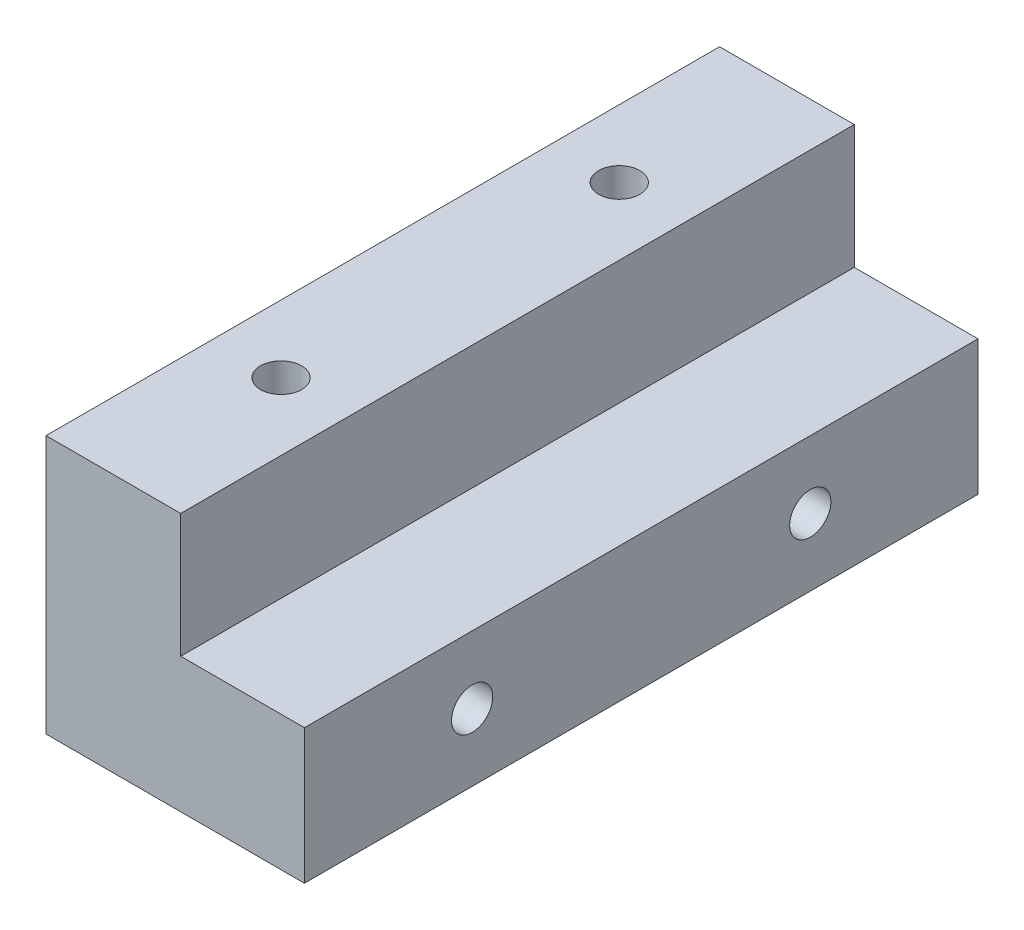
ISO-10303-21;
HEADER;
FILE_DESCRIPTION(('STEP AP214'),'2;1');
FILE_NAME('part.step','',(''),(''),'','','');
FILE_SCHEMA(('AUTOMOTIVE_DESIGN { 1 0 10303 214 1 1 1 1 }'));
ENDSEC;
DATA;
#1=APPLICATION_CONTEXT('core data for automotive mechanical design processes');
#2=APPLICATION_PROTOCOL_DEFINITION('international standard','automotive_design',2000,#1);
#3=PRODUCT_CONTEXT('',#1,'mechanical');
#4=PRODUCT('Part','Part','',(#3));
#5=PRODUCT_RELATED_PRODUCT_CATEGORY('part','',(#4));
#6=PRODUCT_DEFINITION_FORMATION('','',#4);
#7=PRODUCT_DEFINITION_CONTEXT('part definition',#1,'design');
#8=PRODUCT_DEFINITION('design','',#6,#7);
#9=PRODUCT_DEFINITION_SHAPE('','',#8);
#10=(LENGTH_UNIT() NAMED_UNIT(*) SI_UNIT(.MILLI.,.METRE.));
#11=(NAMED_UNIT(*) PLANE_ANGLE_UNIT() SI_UNIT($,.RADIAN.));
#12=(NAMED_UNIT(*) SI_UNIT($,.STERADIAN.) SOLID_ANGLE_UNIT());
#13=UNCERTAINTY_MEASURE_WITH_UNIT(LENGTH_MEASURE(1.E-05),#10,'distance_accuracy_value','');
#14=(GEOMETRIC_REPRESENTATION_CONTEXT(3) GLOBAL_UNCERTAINTY_ASSIGNED_CONTEXT((#13)) GLOBAL_UNIT_ASSIGNED_CONTEXT((#10,
#11,#12)) REPRESENTATION_CONTEXT('',''));
#15=CARTESIAN_POINT('',(0.,0.,0.));
#16=DIRECTION('',(0.,0.,1.));
#17=DIRECTION('',(1.,0.,0.));
#18=AXIS2_PLACEMENT_3D('',#15,#16,#17);
#19=CARTESIAN_POINT('',(4.9,9.4,24.5));
#20=DIRECTION('',(0.,-1.,0.));
#21=DIRECTION('',(1.,0.,0.));
#22=AXIS2_PLACEMENT_3D('',#19,#20,#21);
#23=PLANE('',#22);
#24=CARTESIAN_POINT('',(2.45,9.4,18.4));
#25=DIRECTION('',(0.,1.,0.));
#26=DIRECTION('',(-1.,0.,0.));
#27=AXIS2_PLACEMENT_3D('',#24,#25,#26);
#28=CIRCLE('',#27,0.75);
#29=CARTESIAN_POINT('',(1.7,9.4,18.4));
#30=VERTEX_POINT('',#29);
#31=EDGE_CURVE('E159',#30,#30,#28,.T.);
#32=ORIENTED_EDGE('',*,*,#31,.F.);
#33=EDGE_LOOP('',(#32));
#34=FACE_BOUND('',#33,.T.);
#35=CARTESIAN_POINT('',(2.45,9.4,6.1));
#36=DIRECTION('',(0.,1.,0.));
#37=DIRECTION('',(-1.,0.,0.));
#38=AXIS2_PLACEMENT_3D('',#35,#36,#37);
#39=CIRCLE('',#38,0.75);
#40=CARTESIAN_POINT('',(1.7,9.4,6.1));
#41=VERTEX_POINT('',#40);
#42=EDGE_CURVE('E162',#41,#41,#39,.T.);
#43=ORIENTED_EDGE('',*,*,#42,.F.);
#44=EDGE_LOOP('',(#43));
#45=FACE_BOUND('',#44,.T.);
#46=DIRECTION('',(-1.,0.,0.));
#47=VECTOR('',#46,1.);
#48=CARTESIAN_POINT('',(4.9,9.4,0.));
#49=LINE('',#48,#47);
#50=CARTESIAN_POINT('',(4.9,9.4,0.));
#51=VERTEX_POINT('',#50);
#52=CARTESIAN_POINT('',(0.,9.4,0.));
#53=VERTEX_POINT('',#52);
#54=EDGE_CURVE('E116',#51,#53,#49,.T.);
#55=ORIENTED_EDGE('',*,*,#54,.T.);
#56=DIRECTION('',(0.,0.,-1.));
#57=VECTOR('',#56,1.);
#58=CARTESIAN_POINT('',(0.,9.4,24.5));
#59=LINE('',#58,#57);
#60=CARTESIAN_POINT('',(0.,9.4,24.5));
#61=VERTEX_POINT('',#60);
#62=EDGE_CURVE('E11',#61,#53,#59,.T.);
#63=ORIENTED_EDGE('',*,*,#62,.F.);
#64=DIRECTION('',(-1.,0.,0.));
#65=VECTOR('',#64,1.);
#66=CARTESIAN_POINT('',(4.9,9.4,24.5));
#67=LINE('',#66,#65);
#68=CARTESIAN_POINT('',(4.9,9.4,24.5));
#69=VERTEX_POINT('',#68);
#70=EDGE_CURVE('E127',#69,#61,#67,.T.);
#71=ORIENTED_EDGE('',*,*,#70,.F.);
#72=DIRECTION('',(0.,0.,-1.));
#73=VECTOR('',#72,1.);
#74=CARTESIAN_POINT('',(4.9,9.4,24.5));
#75=LINE('',#74,#73);
#76=EDGE_CURVE('E112',#69,#51,#75,.T.);
#77=ORIENTED_EDGE('',*,*,#76,.T.);
#78=EDGE_LOOP('',(#55,#63,#71,#77));
#79=FACE_BOUND('',#78,.T.);
#80=ADVANCED_FACE('F32',(#34,#45,#79),#23,.F.);
#81=CARTESIAN_POINT('',(0.,9.4,24.5));
#82=DIRECTION('',(1.,0.,0.));
#83=DIRECTION('',(0.,1.,0.));
#84=AXIS2_PLACEMENT_3D('',#81,#82,#83);
#85=PLANE('',#84);
#86=DIRECTION('',(0.,-1.,0.));
#87=VECTOR('',#86,1.);
#88=CARTESIAN_POINT('',(0.,9.4,0.));
#89=LINE('',#88,#87);
#90=CARTESIAN_POINT('',(0.,0.,0.));
#91=VERTEX_POINT('',#90);
#92=EDGE_CURVE('E119',#53,#91,#89,.T.);
#93=ORIENTED_EDGE('',*,*,#92,.T.);
#94=DIRECTION('',(0.,0.,-1.));
#95=VECTOR('',#94,1.);
#96=CARTESIAN_POINT('',(0.,0.,24.5));
#97=LINE('',#96,#95);
#98=CARTESIAN_POINT('',(0.,0.,24.5));
#99=VERTEX_POINT('',#98);
#100=EDGE_CURVE('E40',#99,#91,#97,.T.);
#101=ORIENTED_EDGE('',*,*,#100,.F.);
#102=DIRECTION('',(0.,-1.,0.));
#103=VECTOR('',#102,1.);
#104=CARTESIAN_POINT('',(0.,9.4,24.5));
#105=LINE('',#104,#103);
#106=EDGE_CURVE('E85',#61,#99,#105,.T.);
#107=ORIENTED_EDGE('',*,*,#106,.F.);
#108=ORIENTED_EDGE('',*,*,#62,.T.);
#109=EDGE_LOOP('',(#93,#101,#107,#108));
#110=FACE_BOUND('',#109,.T.);
#111=ADVANCED_FACE('F151',(#110),#85,.F.);
#112=CARTESIAN_POINT('',(0.,0.,24.5));
#113=DIRECTION('',(0.,1.,0.));
#114=DIRECTION('',(-1.,0.,0.));
#115=AXIS2_PLACEMENT_3D('',#112,#113,#114);
#116=PLANE('',#115);
#117=DIRECTION('',(1.,0.,0.));
#118=VECTOR('',#117,1.);
#119=CARTESIAN_POINT('',(0.,0.,0.));
#120=LINE('',#119,#118);
#121=CARTESIAN_POINT('',(9.4,0.,0.));
#122=VERTEX_POINT('',#121);
#123=EDGE_CURVE('E122',#91,#122,#120,.T.);
#124=ORIENTED_EDGE('',*,*,#123,.T.);
#125=DIRECTION('',(0.,0.,-1.));
#126=VECTOR('',#125,1.);
#127=CARTESIAN_POINT('',(9.4,0.,24.5));
#128=LINE('',#127,#126);
#129=CARTESIAN_POINT('',(9.4,0.,24.5));
#130=VERTEX_POINT('',#129);
#131=EDGE_CURVE('E107',#130,#122,#128,.T.);
#132=ORIENTED_EDGE('',*,*,#131,.F.);
#133=DIRECTION('',(1.,0.,0.));
#134=VECTOR('',#133,1.);
#135=CARTESIAN_POINT('',(0.,0.,24.5));
#136=LINE('',#135,#134);
#137=EDGE_CURVE('E98',#99,#130,#136,.T.);
#138=ORIENTED_EDGE('',*,*,#137,.F.);
#139=ORIENTED_EDGE('',*,*,#100,.T.);
#140=EDGE_LOOP('',(#124,#132,#138,#139));
#141=FACE_BOUND('',#140,.T.);
#142=ADVANCED_FACE('F133',(#141),#116,.F.);
#143=CARTESIAN_POINT('',(9.4,0.,24.5));
#144=DIRECTION('',(-1.,0.,0.));
#145=DIRECTION('',(0.,-1.,0.));
#146=AXIS2_PLACEMENT_3D('',#143,#144,#145);
#147=PLANE('',#146);
#148=CARTESIAN_POINT('',(9.4,2.45,18.4));
#149=DIRECTION('',(1.,0.,0.));
#150=DIRECTION('',(0.,1.,0.));
#151=AXIS2_PLACEMENT_3D('',#148,#149,#150);
#152=CIRCLE('',#151,0.750000000000002);
#153=CARTESIAN_POINT('',(9.4,3.2,18.4));
#154=VERTEX_POINT('',#153);
#155=EDGE_CURVE('E168',#154,#154,#152,.T.);
#156=ORIENTED_EDGE('',*,*,#155,.F.);
#157=EDGE_LOOP('',(#156));
#158=FACE_BOUND('',#157,.T.);
#159=CARTESIAN_POINT('',(9.4,2.45,6.1));
#160=DIRECTION('',(1.,0.,0.));
#161=DIRECTION('',(0.,1.,0.));
#162=AXIS2_PLACEMENT_3D('',#159,#160,#161);
#163=CIRCLE('',#162,0.75);
#164=CARTESIAN_POINT('',(9.4,3.2,6.1));
#165=VERTEX_POINT('',#164);
#166=EDGE_CURVE('E177',#165,#165,#163,.T.);
#167=ORIENTED_EDGE('',*,*,#166,.F.);
#168=EDGE_LOOP('',(#167));
#169=FACE_BOUND('',#168,.T.);
#170=DIRECTION('',(0.,1.,0.));
#171=VECTOR('',#170,1.);
#172=CARTESIAN_POINT('',(9.4,0.,0.));
#173=LINE('',#172,#171);
#174=CARTESIAN_POINT('',(9.4,4.9,0.));
#175=VERTEX_POINT('',#174);
#176=EDGE_CURVE('E106',#122,#175,#173,.T.);
#177=ORIENTED_EDGE('',*,*,#176,.T.);
#178=DIRECTION('',(0.,0.,-1.));
#179=VECTOR('',#178,1.);
#180=CARTESIAN_POINT('',(9.4,4.9,24.5));
#181=LINE('',#180,#179);
#182=CARTESIAN_POINT('',(9.4,4.9,24.5));
#183=VERTEX_POINT('',#182);
#184=EDGE_CURVE('E103',#183,#175,#181,.T.);
#185=ORIENTED_EDGE('',*,*,#184,.F.);
#186=DIRECTION('',(0.,1.,0.));
#187=VECTOR('',#186,1.);
#188=CARTESIAN_POINT('',(9.4,0.,24.5));
#189=LINE('',#188,#187);
#190=EDGE_CURVE('E92',#130,#183,#189,.T.);
#191=ORIENTED_EDGE('',*,*,#190,.F.);
#192=ORIENTED_EDGE('',*,*,#131,.T.);
#193=EDGE_LOOP('',(#177,#185,#191,#192));
#194=FACE_BOUND('',#193,.T.);
#195=ADVANCED_FACE('F104',(#158,#169,#194),#147,.F.);
#196=CARTESIAN_POINT('',(9.4,4.9,24.5));
#197=DIRECTION('',(0.,-1.,0.));
#198=DIRECTION('',(1.,0.,0.));
#199=AXIS2_PLACEMENT_3D('',#196,#197,#198);
#200=PLANE('',#199);
#201=DIRECTION('',(-1.,0.,0.));
#202=VECTOR('',#201,1.);
#203=CARTESIAN_POINT('',(9.4,4.9,0.));
#204=LINE('',#203,#202);
#205=CARTESIAN_POINT('',(4.9,4.9,0.));
#206=VERTEX_POINT('',#205);
#207=EDGE_CURVE('E71',#175,#206,#204,.T.);
#208=ORIENTED_EDGE('',*,*,#207,.T.);
#209=DIRECTION('',(0.,0.,-1.));
#210=VECTOR('',#209,1.);
#211=CARTESIAN_POINT('',(4.9,4.9,24.5));
#212=LINE('',#211,#210);
#213=CARTESIAN_POINT('',(4.9,4.9,24.5));
#214=VERTEX_POINT('',#213);
#215=EDGE_CURVE('E108',#214,#206,#212,.T.);
#216=ORIENTED_EDGE('',*,*,#215,.F.);
#217=DIRECTION('',(-1.,0.,0.));
#218=VECTOR('',#217,1.);
#219=CARTESIAN_POINT('',(9.4,4.9,24.5));
#220=LINE('',#219,#218);
#221=EDGE_CURVE('E96',#183,#214,#220,.T.);
#222=ORIENTED_EDGE('',*,*,#221,.F.);
#223=ORIENTED_EDGE('',*,*,#184,.T.);
#224=EDGE_LOOP('',(#208,#216,#222,#223));
#225=FACE_BOUND('',#224,.T.);
#226=ADVANCED_FACE('F110',(#225),#200,.F.);
#227=CARTESIAN_POINT('',(4.9,4.9,24.5));
#228=DIRECTION('',(-1.,0.,0.));
#229=DIRECTION('',(0.,0.,1.));
#230=AXIS2_PLACEMENT_3D('',#227,#228,#229);
#231=PLANE('',#230);
#232=DIRECTION('',(0.,1.,0.));
#233=VECTOR('',#232,1.);
#234=CARTESIAN_POINT('',(4.9,4.9,0.));
#235=LINE('',#234,#233);
#236=EDGE_CURVE('E77',#206,#51,#235,.T.);
#237=ORIENTED_EDGE('',*,*,#236,.T.);
#238=ORIENTED_EDGE('',*,*,#76,.F.);
#239=DIRECTION('',(0.,1.,0.));
#240=VECTOR('',#239,1.);
#241=CARTESIAN_POINT('',(4.9,4.9,24.5));
#242=LINE('',#241,#240);
#243=EDGE_CURVE('E48',#214,#69,#242,.T.);
#244=ORIENTED_EDGE('',*,*,#243,.F.);
#245=ORIENTED_EDGE('',*,*,#215,.T.);
#246=EDGE_LOOP('',(#237,#238,#244,#245));
#247=FACE_BOUND('',#246,.T.);
#248=ADVANCED_FACE('F140',(#247),#231,.F.);
#249=CARTESIAN_POINT('',(0.,9.4,24.5));
#250=DIRECTION('',(0.,0.,1.));
#251=DIRECTION('',(1.,0.,0.));
#252=AXIS2_PLACEMENT_3D('',#249,#250,#251);
#253=PLANE('',#252);
#254=ORIENTED_EDGE('',*,*,#70,.T.);
#255=ORIENTED_EDGE('',*,*,#106,.T.);
#256=ORIENTED_EDGE('',*,*,#137,.T.);
#257=ORIENTED_EDGE('',*,*,#190,.T.);
#258=ORIENTED_EDGE('',*,*,#221,.T.);
#259=ORIENTED_EDGE('',*,*,#243,.T.);
#260=EDGE_LOOP('',(#254,#255,#256,#257,#258,#259));
#261=FACE_BOUND('',#260,.T.);
#262=ADVANCED_FACE('F94',(#261),#253,.T.);
#263=CARTESIAN_POINT('',(0.,9.4,0.));
#264=DIRECTION('',(0.,0.,1.));
#265=DIRECTION('',(1.,0.,0.));
#266=AXIS2_PLACEMENT_3D('',#263,#264,#265);
#267=PLANE('',#266);
#268=ORIENTED_EDGE('',*,*,#54,.F.);
#269=ORIENTED_EDGE('',*,*,#236,.F.);
#270=ORIENTED_EDGE('',*,*,#207,.F.);
#271=ORIENTED_EDGE('',*,*,#176,.F.);
#272=ORIENTED_EDGE('',*,*,#123,.F.);
#273=ORIENTED_EDGE('',*,*,#92,.F.);
#274=EDGE_LOOP('',(#268,#269,#270,#271,#272,#273));
#275=FACE_BOUND('',#274,.T.);
#276=ADVANCED_FACE('F136',(#275),#267,.F.);
#277=CARTESIAN_POINT('',(4.4,2.45,6.1));
#278=DIRECTION('',(1.,0.,0.));
#279=DIRECTION('',(0.,1.,0.));
#280=AXIS2_PLACEMENT_3D('',#277,#278,#279);
#281=CYLINDRICAL_SURFACE('',#280,0.75);
#282=CARTESIAN_POINT('',(4.4,2.45,6.1));
#283=DIRECTION('',(1.,0.,0.));
#284=DIRECTION('',(0.,1.,0.));
#285=AXIS2_PLACEMENT_3D('',#282,#283,#284);
#286=CIRCLE('',#285,0.75);
#287=CARTESIAN_POINT('',(4.4,3.2,6.1));
#288=VERTEX_POINT('',#287);
#289=EDGE_CURVE('E120',#288,#288,#286,.T.);
#290=ORIENTED_EDGE('',*,*,#289,.F.);
#291=EDGE_LOOP('',(#290));
#292=FACE_BOUND('',#291,.T.);
#293=ORIENTED_EDGE('',*,*,#166,.T.);
#294=EDGE_LOOP('',(#293));
#295=FACE_BOUND('',#294,.T.);
#296=ADVANCED_FACE('F187',(#292,#295),#281,.F.);
#297=CARTESIAN_POINT('',(4.4,2.45,6.1));
#298=DIRECTION('',(1.,0.,0.));
#299=DIRECTION('',(0.,1.,0.));
#300=AXIS2_PLACEMENT_3D('',#297,#298,#299);
#301=PLANE('',#300);
#302=ORIENTED_EDGE('',*,*,#289,.T.);
#303=EDGE_LOOP('',(#302));
#304=FACE_BOUND('',#303,.T.);
#305=ADVANCED_FACE('F201',(#304),#301,.T.);
#306=CARTESIAN_POINT('',(4.4,2.45,18.4));
#307=DIRECTION('',(1.,0.,0.));
#308=DIRECTION('',(0.,1.,0.));
#309=AXIS2_PLACEMENT_3D('',#306,#307,#308);
#310=CYLINDRICAL_SURFACE('',#309,0.750000000000002);
#311=CARTESIAN_POINT('',(4.4,2.45,18.4));
#312=DIRECTION('',(1.,0.,0.));
#313=DIRECTION('',(0.,1.,0.));
#314=AXIS2_PLACEMENT_3D('',#311,#312,#313);
#315=CIRCLE('',#314,0.750000000000002);
#316=CARTESIAN_POINT('',(4.4,3.2,18.4));
#317=VERTEX_POINT('',#316);
#318=EDGE_CURVE('E174',#317,#317,#315,.T.);
#319=ORIENTED_EDGE('',*,*,#318,.F.);
#320=EDGE_LOOP('',(#319));
#321=FACE_BOUND('',#320,.T.);
#322=ORIENTED_EDGE('',*,*,#155,.T.);
#323=EDGE_LOOP('',(#322));
#324=FACE_BOUND('',#323,.T.);
#325=ADVANCED_FACE('F198',(#321,#324),#310,.F.);
#326=CARTESIAN_POINT('',(4.4,2.45,18.4));
#327=DIRECTION('',(1.,0.,0.));
#328=DIRECTION('',(0.,1.,0.));
#329=AXIS2_PLACEMENT_3D('',#326,#327,#328);
#330=PLANE('',#329);
#331=ORIENTED_EDGE('',*,*,#318,.T.);
#332=EDGE_LOOP('',(#331));
#333=FACE_BOUND('',#332,.T.);
#334=ADVANCED_FACE('F200',(#333),#330,.T.);
#335=CARTESIAN_POINT('',(2.45,4.4,6.1));
#336=DIRECTION('',(0.,1.,0.));
#337=DIRECTION('',(-1.,0.,0.));
#338=AXIS2_PLACEMENT_3D('',#335,#336,#337);
#339=CYLINDRICAL_SURFACE('',#338,0.75);
#340=CARTESIAN_POINT('',(2.45,4.4,6.1));
#341=DIRECTION('',(0.,1.,0.));
#342=DIRECTION('',(-1.,0.,0.));
#343=AXIS2_PLACEMENT_3D('',#340,#341,#342);
#344=CIRCLE('',#343,0.75);
#345=CARTESIAN_POINT('',(1.7,4.4,6.1));
#346=VERTEX_POINT('',#345);
#347=EDGE_CURVE('E164',#346,#346,#344,.T.);
#348=ORIENTED_EDGE('',*,*,#347,.F.);
#349=EDGE_LOOP('',(#348));
#350=FACE_BOUND('',#349,.T.);
#351=ORIENTED_EDGE('',*,*,#42,.T.);
#352=EDGE_LOOP('',(#351));
#353=FACE_BOUND('',#352,.T.);
#354=ADVANCED_FACE('F208',(#350,#353),#339,.F.);
#355=CARTESIAN_POINT('',(2.45,4.4,6.1));
#356=DIRECTION('',(0.,1.,0.));
#357=DIRECTION('',(-1.,0.,0.));
#358=AXIS2_PLACEMENT_3D('',#355,#356,#357);
#359=PLANE('',#358);
#360=ORIENTED_EDGE('',*,*,#347,.T.);
#361=EDGE_LOOP('',(#360));
#362=FACE_BOUND('',#361,.T.);
#363=ADVANCED_FACE('F255',(#362),#359,.T.);
#364=CARTESIAN_POINT('',(2.45,4.4,18.4));
#365=DIRECTION('',(0.,1.,0.));
#366=DIRECTION('',(-1.,0.,0.));
#367=AXIS2_PLACEMENT_3D('',#364,#365,#366);
#368=CYLINDRICAL_SURFACE('',#367,0.75);
#369=CARTESIAN_POINT('',(2.45,4.4,18.4));
#370=DIRECTION('',(0.,1.,0.));
#371=DIRECTION('',(-1.,0.,0.));
#372=AXIS2_PLACEMENT_3D('',#369,#370,#371);
#373=CIRCLE('',#372,0.75);
#374=CARTESIAN_POINT('',(1.7,4.4,18.4));
#375=VERTEX_POINT('',#374);
#376=EDGE_CURVE('E165',#375,#375,#373,.T.);
#377=ORIENTED_EDGE('',*,*,#376,.F.);
#378=EDGE_LOOP('',(#377));
#379=FACE_BOUND('',#378,.T.);
#380=ORIENTED_EDGE('',*,*,#31,.T.);
#381=EDGE_LOOP('',(#380));
#382=FACE_BOUND('',#381,.T.);
#383=ADVANCED_FACE('F264',(#379,#382),#368,.F.);
#384=CARTESIAN_POINT('',(2.45,4.4,18.4));
#385=DIRECTION('',(0.,1.,0.));
#386=DIRECTION('',(-1.,0.,0.));
#387=AXIS2_PLACEMENT_3D('',#384,#385,#386);
#388=PLANE('',#387);
#389=ORIENTED_EDGE('',*,*,#376,.T.);
#390=EDGE_LOOP('',(#389));
#391=FACE_BOUND('',#390,.T.);
#392=ADVANCED_FACE('F274',(#391),#388,.T.);
#393=CLOSED_SHELL('',(#80,#111,#142,#195,#226,#248,#262,#276,#296,#305,#325,#334,#354,#363,#383,#392));
#394=MANIFOLD_SOLID_BREP('B2',#393);
#395=ADVANCED_BREP_SHAPE_REPRESENTATION('',(#18,#394),#14);
#396=SHAPE_DEFINITION_REPRESENTATION(#9,#395);
ENDSEC;
END-ISO-10303-21;
